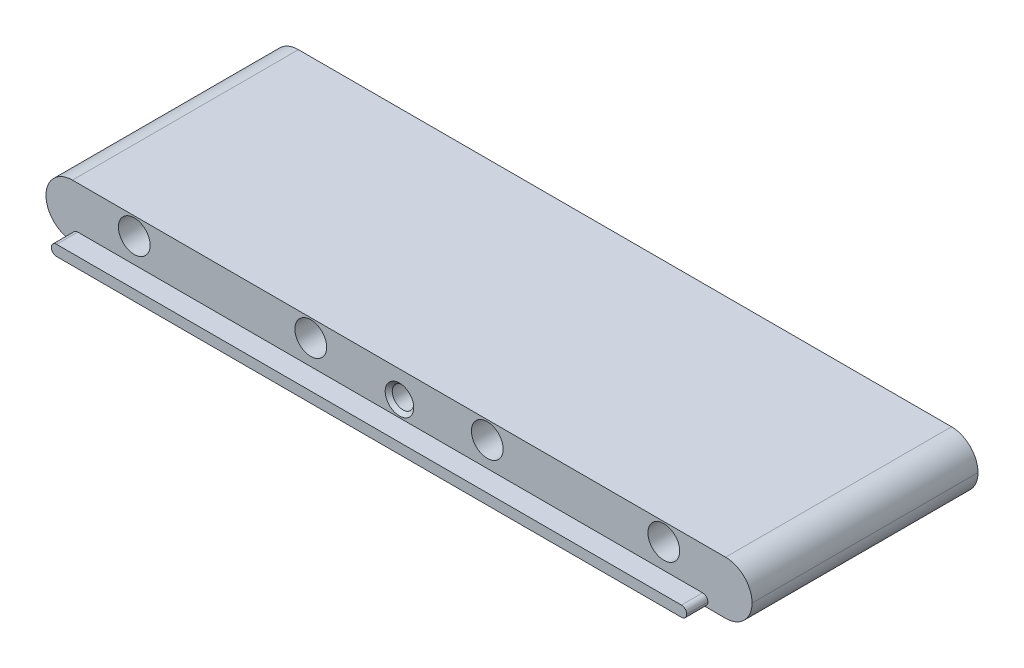
ISO-10303-21;
HEADER;
FILE_DESCRIPTION(('STEP AP214'),'2;1');
FILE_NAME('part.step','',(''),(''),'','','');
FILE_SCHEMA(('AUTOMOTIVE_DESIGN { 1 0 10303 214 1 1 1 1 }'));
ENDSEC;
DATA;
#1=APPLICATION_CONTEXT('core data for automotive mechanical design processes');
#2=APPLICATION_PROTOCOL_DEFINITION('international standard','automotive_design',2000,#1);
#3=PRODUCT_CONTEXT('',#1,'mechanical');
#4=PRODUCT('Part','Part','',(#3));
#5=PRODUCT_RELATED_PRODUCT_CATEGORY('part','',(#4));
#6=PRODUCT_DEFINITION_FORMATION('','',#4);
#7=PRODUCT_DEFINITION_CONTEXT('part definition',#1,'design');
#8=PRODUCT_DEFINITION('design','',#6,#7);
#9=PRODUCT_DEFINITION_SHAPE('','',#8);
#10=(LENGTH_UNIT() NAMED_UNIT(*) SI_UNIT(.MILLI.,.METRE.));
#11=(NAMED_UNIT(*) PLANE_ANGLE_UNIT() SI_UNIT($,.RADIAN.));
#12=(NAMED_UNIT(*) SI_UNIT($,.STERADIAN.) SOLID_ANGLE_UNIT());
#13=UNCERTAINTY_MEASURE_WITH_UNIT(LENGTH_MEASURE(1.E-05),#10,'distance_accuracy_value','');
#14=(GEOMETRIC_REPRESENTATION_CONTEXT(3) GLOBAL_UNCERTAINTY_ASSIGNED_CONTEXT((#13)) GLOBAL_UNIT_ASSIGNED_CONTEXT((#10,
#11,#12)) REPRESENTATION_CONTEXT('',''));
#15=CARTESIAN_POINT('',(0.,0.,0.));
#16=DIRECTION('',(0.,0.,1.));
#17=DIRECTION('',(1.,0.,0.));
#18=AXIS2_PLACEMENT_3D('',#15,#16,#17);
#19=CARTESIAN_POINT('',(0.,0.,64.));
#20=DIRECTION('',(0.,0.,-1.));
#21=DIRECTION('',(-1.,0.,0.));
#22=AXIS2_PLACEMENT_3D('',#19,#20,#21);
#23=PLANE('',#22);
#24=CARTESIAN_POINT('',(0.125314072334449,0.,64.));
#25=DIRECTION('',(0.,0.,-1.));
#26=DIRECTION('',(-1.,0.,0.));
#27=AXIS2_PLACEMENT_3D('',#24,#25,#26);
#28=CIRCLE('',#27,4.05);
#29=CARTESIAN_POINT('',(-3.92468592766555,0.,64.));
#30=VERTEX_POINT('',#29);
#31=EDGE_CURVE('E12',#30,#30,#28,.T.);
#32=ORIENTED_EDGE('',*,*,#31,.T.);
#33=EDGE_LOOP('',(#32));
#34=FACE_BOUND('',#33,.T.);
#35=CARTESIAN_POINT('',(75.,2.5,64.));
#36=DIRECTION('',(0.,0.,1.));
#37=DIRECTION('',(1.,0.,0.));
#38=AXIS2_PLACEMENT_3D('',#35,#36,#37);
#39=CIRCLE('',#38,4.5);
#40=CARTESIAN_POINT('',(79.5,2.5,64.));
#41=VERTEX_POINT('',#40);
#42=EDGE_CURVE('E397',#41,#41,#39,.T.);
#43=ORIENTED_EDGE('',*,*,#42,.F.);
#44=EDGE_LOOP('',(#43));
#45=FACE_BOUND('',#44,.T.);
#46=CARTESIAN_POINT('',(25.,2.49999999999948,64.));
#47=DIRECTION('',(0.,0.,1.));
#48=DIRECTION('',(1.,0.,0.));
#49=AXIS2_PLACEMENT_3D('',#46,#47,#48);
#50=CIRCLE('',#49,4.5);
#51=CARTESIAN_POINT('',(29.5,2.49999999999948,64.));
#52=VERTEX_POINT('',#51);
#53=EDGE_CURVE('E389',#52,#52,#50,.T.);
#54=ORIENTED_EDGE('',*,*,#53,.F.);
#55=EDGE_LOOP('',(#54));
#56=FACE_BOUND('',#55,.T.);
#57=CARTESIAN_POINT('',(-25.,2.4999999999993,64.));
#58=DIRECTION('',(0.,0.,1.));
#59=DIRECTION('',(1.,0.,0.));
#60=AXIS2_PLACEMENT_3D('',#57,#58,#59);
#61=CIRCLE('',#60,4.5);
#62=CARTESIAN_POINT('',(-20.5,2.4999999999993,64.));
#63=VERTEX_POINT('',#62);
#64=EDGE_CURVE('E381',#63,#63,#61,.T.);
#65=ORIENTED_EDGE('',*,*,#64,.F.);
#66=EDGE_LOOP('',(#65));
#67=FACE_BOUND('',#66,.T.);
#68=CARTESIAN_POINT('',(-75.,2.49999999999895,64.));
#69=DIRECTION('',(0.,0.,1.));
#70=DIRECTION('',(1.,0.,0.));
#71=AXIS2_PLACEMENT_3D('',#68,#69,#70);
#72=CIRCLE('',#71,4.5);
#73=CARTESIAN_POINT('',(-70.5,2.49999999999895,64.));
#74=VERTEX_POINT('',#73);
#75=EDGE_CURVE('E377',#74,#74,#72,.T.);
#76=ORIENTED_EDGE('',*,*,#75,.F.);
#77=EDGE_LOOP('',(#76));
#78=FACE_BOUND('',#77,.T.);
#79=CARTESIAN_POINT('',(-91.,-6.,64.));
#80=DIRECTION('',(0.,0.,-1.));
#81=DIRECTION('',(-1.,0.,0.));
#82=AXIS2_PLACEMENT_3D('',#79,#80,#81);
#83=CIRCLE('',#82,1.5);
#84=CARTESIAN_POINT('',(-91.,-7.5,64.));
#85=VERTEX_POINT('',#84);
#86=CARTESIAN_POINT('',(-92.5,-6.,64.));
#87=VERTEX_POINT('',#86);
#88=EDGE_CURVE('E66',#85,#87,#83,.T.);
#89=ORIENTED_EDGE('',*,*,#88,.T.);
#90=CARTESIAN_POINT('',(-91.,-6.,64.));
#91=DIRECTION('',(0.,0.,-1.));
#92=DIRECTION('',(-1.,0.,0.));
#93=AXIS2_PLACEMENT_3D('',#90,#91,#92);
#94=CIRCLE('',#93,1.5);
#95=CARTESIAN_POINT('',(-91.,-4.5,64.));
#96=VERTEX_POINT('',#95);
#97=EDGE_CURVE('E275',#87,#96,#94,.T.);
#98=ORIENTED_EDGE('',*,*,#97,.T.);
#99=DIRECTION('',(-1.,0.,0.));
#100=VECTOR('',#99,1.);
#101=CARTESIAN_POINT('',(-92.5,-4.5,64.));
#102=LINE('',#101,#100);
#103=CARTESIAN_POINT('',(85.9999999999999,-4.5,64.));
#104=VERTEX_POINT('',#103);
#105=EDGE_CURVE('E282',#104,#96,#102,.T.);
#106=ORIENTED_EDGE('',*,*,#105,.F.);
#107=CARTESIAN_POINT('',(86.,-6.,64.));
#108=DIRECTION('',(0.,0.,-1.));
#109=DIRECTION('',(-1.,0.,0.));
#110=AXIS2_PLACEMENT_3D('',#107,#108,#109);
#111=CIRCLE('',#110,1.5);
#112=CARTESIAN_POINT('',(87.5,-6.,64.));
#113=VERTEX_POINT('',#112);
#114=EDGE_CURVE('E73',#104,#113,#111,.T.);
#115=ORIENTED_EDGE('',*,*,#114,.T.);
#116=CARTESIAN_POINT('',(86.,-6.,64.));
#117=DIRECTION('',(0.,0.,-1.));
#118=DIRECTION('',(-1.,0.,0.));
#119=AXIS2_PLACEMENT_3D('',#116,#117,#118);
#120=CIRCLE('',#119,1.5);
#121=CARTESIAN_POINT('',(86.,-7.5,64.));
#122=VERTEX_POINT('',#121);
#123=EDGE_CURVE('E270',#113,#122,#120,.T.);
#124=ORIENTED_EDGE('',*,*,#123,.T.);
#125=DIRECTION('',(1.,0.,0.));
#126=VECTOR('',#125,1.);
#127=CARTESIAN_POINT('',(-100.,-7.5,64.));
#128=LINE('',#127,#126);
#129=CARTESIAN_POINT('',(92.5,-7.5,64.));
#130=VERTEX_POINT('',#129);
#131=EDGE_CURVE('E183',#122,#130,#128,.T.);
#132=ORIENTED_EDGE('',*,*,#131,.T.);
#133=CARTESIAN_POINT('',(92.5,0.,64.));
#134=DIRECTION('',(0.,0.,-1.));
#135=DIRECTION('',(-1.,0.,0.));
#136=AXIS2_PLACEMENT_3D('',#133,#134,#135);
#137=CIRCLE('',#136,7.5);
#138=CARTESIAN_POINT('',(100.,0.,64.));
#139=VERTEX_POINT('',#138);
#140=EDGE_CURVE('E218',#130,#139,#137,.F.);
#141=ORIENTED_EDGE('',*,*,#140,.T.);
#142=CARTESIAN_POINT('',(92.5,0.,64.));
#143=DIRECTION('',(0.,0.,-1.));
#144=DIRECTION('',(-1.,0.,0.));
#145=AXIS2_PLACEMENT_3D('',#142,#143,#144);
#146=CIRCLE('',#145,7.5);
#147=CARTESIAN_POINT('',(92.5,7.5,64.));
#148=VERTEX_POINT('',#147);
#149=EDGE_CURVE('E221',#139,#148,#146,.F.);
#150=ORIENTED_EDGE('',*,*,#149,.T.);
#151=DIRECTION('',(-1.,0.,0.));
#152=VECTOR('',#151,1.);
#153=CARTESIAN_POINT('',(-100.,7.5,64.));
#154=LINE('',#153,#152);
#155=CARTESIAN_POINT('',(-92.5,7.5,64.));
#156=VERTEX_POINT('',#155);
#157=EDGE_CURVE('E162',#148,#156,#154,.T.);
#158=ORIENTED_EDGE('',*,*,#157,.T.);
#159=CARTESIAN_POINT('',(-92.5,0.,64.));
#160=DIRECTION('',(0.,0.,-1.));
#161=DIRECTION('',(-1.,0.,0.));
#162=AXIS2_PLACEMENT_3D('',#159,#160,#161);
#163=CIRCLE('',#162,7.5);
#164=CARTESIAN_POINT('',(-100.,0.,64.));
#165=VERTEX_POINT('',#164);
#166=EDGE_CURVE('E215',#156,#165,#163,.F.);
#167=ORIENTED_EDGE('',*,*,#166,.T.);
#168=CARTESIAN_POINT('',(-92.5,0.,64.));
#169=DIRECTION('',(0.,0.,-1.));
#170=DIRECTION('',(-1.,0.,0.));
#171=AXIS2_PLACEMENT_3D('',#168,#169,#170);
#172=CIRCLE('',#171,7.5);
#173=CARTESIAN_POINT('',(-92.5,-7.5,64.));
#174=VERTEX_POINT('',#173);
#175=EDGE_CURVE('E151',#165,#174,#172,.F.);
#176=ORIENTED_EDGE('',*,*,#175,.T.);
#177=DIRECTION('',(-1.,0.,0.));
#178=VECTOR('',#177,1.);
#179=CARTESIAN_POINT('',(-100.,-7.5,64.));
#180=LINE('',#179,#178);
#181=EDGE_CURVE('E258',#85,#174,#180,.T.);
#182=ORIENTED_EDGE('',*,*,#181,.F.);
#183=EDGE_LOOP('',(#89,#98,#106,#115,#124,#132,#141,#150,#158,#167,#176,#182));
#184=FACE_BOUND('',#183,.T.);
#185=ADVANCED_FACE('F49',(#34,#45,#56,#67,#78,#184),#23,.F.);
#186=CARTESIAN_POINT('',(0.,0.,0.));
#187=DIRECTION('',(0.,0.,-1.));
#188=DIRECTION('',(-1.,0.,0.));
#189=AXIS2_PLACEMENT_3D('',#186,#187,#188);
#190=PLANE('',#189);
#191=CARTESIAN_POINT('',(-25.,2.4999999999993,0.));
#192=DIRECTION('',(0.,0.,1.));
#193=DIRECTION('',(1.,0.,0.));
#194=AXIS2_PLACEMENT_3D('',#191,#192,#193);
#195=CIRCLE('',#194,2.6);
#196=CARTESIAN_POINT('',(-22.4,2.4999999999993,0.));
#197=VERTEX_POINT('',#196);
#198=EDGE_CURVE('E410',#197,#197,#195,.T.);
#199=ORIENTED_EDGE('',*,*,#198,.T.);
#200=EDGE_LOOP('',(#199));
#201=FACE_BOUND('',#200,.T.);
#202=CARTESIAN_POINT('',(75.,2.5,0.));
#203=DIRECTION('',(0.,0.,1.));
#204=DIRECTION('',(1.,0.,0.));
#205=AXIS2_PLACEMENT_3D('',#202,#203,#204);
#206=CIRCLE('',#205,2.6);
#207=CARTESIAN_POINT('',(77.6,2.5,0.));
#208=VERTEX_POINT('',#207);
#209=EDGE_CURVE('E173',#208,#208,#206,.T.);
#210=ORIENTED_EDGE('',*,*,#209,.T.);
#211=EDGE_LOOP('',(#210));
#212=FACE_BOUND('',#211,.T.);
#213=DIRECTION('',(-1.,0.,0.));
#214=VECTOR('',#213,1.);
#215=CARTESIAN_POINT('',(-100.,7.5,0.));
#216=LINE('',#215,#214);
#217=CARTESIAN_POINT('',(92.5,7.5,0.));
#218=VERTEX_POINT('',#217);
#219=CARTESIAN_POINT('',(-92.5,7.5,0.));
#220=VERTEX_POINT('',#219);
#221=EDGE_CURVE('E159',#218,#220,#216,.T.);
#222=ORIENTED_EDGE('',*,*,#221,.F.);
#223=CARTESIAN_POINT('',(92.5,0.,0.));
#224=DIRECTION('',(0.,0.,-1.));
#225=DIRECTION('',(-1.,0.,0.));
#226=AXIS2_PLACEMENT_3D('',#223,#224,#225);
#227=CIRCLE('',#226,7.5);
#228=CARTESIAN_POINT('',(100.,0.,0.));
#229=VERTEX_POINT('',#228);
#230=EDGE_CURVE('E140',#218,#229,#227,.T.);
#231=ORIENTED_EDGE('',*,*,#230,.T.);
#232=CARTESIAN_POINT('',(92.5,0.,0.));
#233=DIRECTION('',(0.,0.,-1.));
#234=DIRECTION('',(-1.,0.,0.));
#235=AXIS2_PLACEMENT_3D('',#232,#233,#234);
#236=CIRCLE('',#235,7.5);
#237=CARTESIAN_POINT('',(92.5,-7.5,0.));
#238=VERTEX_POINT('',#237);
#239=EDGE_CURVE('E152',#229,#238,#236,.T.);
#240=ORIENTED_EDGE('',*,*,#239,.T.);
#241=DIRECTION('',(1.,0.,0.));
#242=VECTOR('',#241,1.);
#243=CARTESIAN_POINT('',(-100.,-7.5,0.));
#244=LINE('',#243,#242);
#245=CARTESIAN_POINT('',(-92.5,-7.5,0.));
#246=VERTEX_POINT('',#245);
#247=EDGE_CURVE('E172',#246,#238,#244,.T.);
#248=ORIENTED_EDGE('',*,*,#247,.F.);
#249=CARTESIAN_POINT('',(-92.5,0.,0.));
#250=DIRECTION('',(0.,0.,-1.));
#251=DIRECTION('',(-1.,0.,0.));
#252=AXIS2_PLACEMENT_3D('',#249,#250,#251);
#253=CIRCLE('',#252,7.5);
#254=CARTESIAN_POINT('',(-100.,0.,0.));
#255=VERTEX_POINT('',#254);
#256=EDGE_CURVE('E164',#246,#255,#253,.T.);
#257=ORIENTED_EDGE('',*,*,#256,.T.);
#258=CARTESIAN_POINT('',(-92.5,0.,0.));
#259=DIRECTION('',(0.,0.,-1.));
#260=DIRECTION('',(-1.,0.,0.));
#261=AXIS2_PLACEMENT_3D('',#258,#259,#260);
#262=CIRCLE('',#261,7.5);
#263=EDGE_CURVE('E170',#255,#220,#262,.T.);
#264=ORIENTED_EDGE('',*,*,#263,.T.);
#265=EDGE_LOOP('',(#222,#231,#240,#248,#257,#264));
#266=FACE_BOUND('',#265,.T.);
#267=CARTESIAN_POINT('',(25.,2.49999999999948,0.));
#268=DIRECTION('',(0.,0.,1.));
#269=DIRECTION('',(1.,0.,0.));
#270=AXIS2_PLACEMENT_3D('',#267,#268,#269);
#271=CIRCLE('',#270,2.6);
#272=CARTESIAN_POINT('',(27.6,2.49999999999948,0.));
#273=VERTEX_POINT('',#272);
#274=EDGE_CURVE('E180',#273,#273,#271,.T.);
#275=ORIENTED_EDGE('',*,*,#274,.T.);
#276=EDGE_LOOP('',(#275));
#277=FACE_BOUND('',#276,.T.);
#278=CARTESIAN_POINT('',(-75.,2.49999999999895,0.));
#279=DIRECTION('',(0.,0.,1.));
#280=DIRECTION('',(1.,0.,0.));
#281=AXIS2_PLACEMENT_3D('',#278,#279,#280);
#282=CIRCLE('',#281,2.6);
#283=CARTESIAN_POINT('',(-72.4,2.49999999999895,0.));
#284=VERTEX_POINT('',#283);
#285=EDGE_CURVE('E203',#284,#284,#282,.T.);
#286=ORIENTED_EDGE('',*,*,#285,.T.);
#287=EDGE_LOOP('',(#286));
#288=FACE_BOUND('',#287,.T.);
#289=ADVANCED_FACE('F167',(#201,#212,#266,#277,#288),#190,.T.);
#290=CARTESIAN_POINT('',(-100.,7.5,64.));
#291=DIRECTION('',(0.,-1.,0.));
#292=DIRECTION('',(1.,0.,0.));
#293=AXIS2_PLACEMENT_3D('',#290,#291,#292);
#294=PLANE('',#293);
#295=ORIENTED_EDGE('',*,*,#157,.F.);
#296=DIRECTION('',(0.,0.,-1.));
#297=VECTOR('',#296,1.);
#298=CARTESIAN_POINT('',(92.5,7.5,64.));
#299=LINE('',#298,#297);
#300=EDGE_CURVE('E144',#148,#218,#299,.T.);
#301=ORIENTED_EDGE('',*,*,#300,.T.);
#302=ORIENTED_EDGE('',*,*,#221,.T.);
#303=DIRECTION('',(0.,0.,-1.));
#304=VECTOR('',#303,1.);
#305=CARTESIAN_POINT('',(-92.5,7.5,64.));
#306=LINE('',#305,#304);
#307=EDGE_CURVE('E165',#220,#156,#306,.F.);
#308=ORIENTED_EDGE('',*,*,#307,.T.);
#309=EDGE_LOOP('',(#295,#301,#302,#308));
#310=FACE_BOUND('',#309,.T.);
#311=ADVANCED_FACE('F157',(#310),#294,.F.);
#312=CARTESIAN_POINT('',(-100.,-7.5,64.));
#313=DIRECTION('',(0.,1.,0.));
#314=DIRECTION('',(-1.,0.,0.));
#315=AXIS2_PLACEMENT_3D('',#312,#313,#314);
#316=PLANE('',#315);
#317=ORIENTED_EDGE('',*,*,#131,.F.);
#318=DIRECTION('',(0.,0.,-1.));
#319=VECTOR('',#318,1.);
#320=CARTESIAN_POINT('',(86.,-7.5,64.));
#321=LINE('',#320,#319);
#322=CARTESIAN_POINT('',(85.9999999999999,-7.5,70.));
#323=VERTEX_POINT('',#322);
#324=EDGE_CURVE('E265',#122,#323,#321,.F.);
#325=ORIENTED_EDGE('',*,*,#324,.T.);
#326=DIRECTION('',(1.,0.,0.));
#327=VECTOR('',#326,1.);
#328=CARTESIAN_POINT('',(-92.5,-7.5,70.));
#329=LINE('',#328,#327);
#330=CARTESIAN_POINT('',(-91.,-7.5,70.));
#331=VERTEX_POINT('',#330);
#332=EDGE_CURVE('E364',#331,#323,#329,.T.);
#333=ORIENTED_EDGE('',*,*,#332,.F.);
#334=DIRECTION('',(0.,0.,-1.));
#335=VECTOR('',#334,1.);
#336=CARTESIAN_POINT('',(-91.,-7.5,64.));
#337=LINE('',#336,#335);
#338=EDGE_CURVE('E261',#331,#85,#337,.T.);
#339=ORIENTED_EDGE('',*,*,#338,.T.);
#340=ORIENTED_EDGE('',*,*,#181,.T.);
#341=DIRECTION('',(0.,0.,-1.));
#342=VECTOR('',#341,1.);
#343=CARTESIAN_POINT('',(-92.5,-7.5,64.));
#344=LINE('',#343,#342);
#345=EDGE_CURVE('E224',#174,#246,#344,.T.);
#346=ORIENTED_EDGE('',*,*,#345,.T.);
#347=ORIENTED_EDGE('',*,*,#247,.T.);
#348=DIRECTION('',(0.,0.,-1.));
#349=VECTOR('',#348,1.);
#350=CARTESIAN_POINT('',(92.5,-7.5,64.));
#351=LINE('',#350,#349);
#352=EDGE_CURVE('E227',#238,#130,#351,.F.);
#353=ORIENTED_EDGE('',*,*,#352,.T.);
#354=EDGE_LOOP('',(#317,#325,#333,#339,#340,#346,#347,#353));
#355=FACE_BOUND('',#354,.T.);
#356=ADVANCED_FACE('F317',(#355),#316,.F.);
#357=CARTESIAN_POINT('',(75.,2.5,64.));
#358=DIRECTION('',(0.,0.,-1.));
#359=DIRECTION('',(-1.,0.,0.));
#360=AXIS2_PLACEMENT_3D('',#357,#358,#359);
#361=CYLINDRICAL_SURFACE('',#360,2.6);
#362=CARTESIAN_POINT('',(75.,2.5,7.));
#363=DIRECTION('',(0.,0.,-1.));
#364=DIRECTION('',(-1.,0.,0.));
#365=AXIS2_PLACEMENT_3D('',#362,#363,#364);
#366=CIRCLE('',#365,2.6);
#367=CARTESIAN_POINT('',(72.4,2.5,7.));
#368=VERTEX_POINT('',#367);
#369=EDGE_CURVE('E199',#368,#368,#366,.T.);
#370=ORIENTED_EDGE('',*,*,#369,.F.);
#371=EDGE_LOOP('',(#370));
#372=FACE_BOUND('',#371,.T.);
#373=ORIENTED_EDGE('',*,*,#209,.F.);
#374=EDGE_LOOP('',(#373));
#375=FACE_BOUND('',#374,.T.);
#376=ADVANCED_FACE('F314',(#372,#375),#361,.F.);
#377=CARTESIAN_POINT('',(25.,2.49999999999948,64.));
#378=DIRECTION('',(0.,0.,-1.));
#379=DIRECTION('',(-1.,0.,0.));
#380=AXIS2_PLACEMENT_3D('',#377,#378,#379);
#381=CYLINDRICAL_SURFACE('',#380,2.6);
#382=CARTESIAN_POINT('',(25.,2.49999999999948,7.));
#383=DIRECTION('',(0.,0.,-1.));
#384=DIRECTION('',(-1.,0.,0.));
#385=AXIS2_PLACEMENT_3D('',#382,#383,#384);
#386=CIRCLE('',#385,2.6);
#387=CARTESIAN_POINT('',(22.4,2.49999999999948,7.));
#388=VERTEX_POINT('',#387);
#389=EDGE_CURVE('E195',#388,#388,#386,.T.);
#390=ORIENTED_EDGE('',*,*,#389,.F.);
#391=EDGE_LOOP('',(#390));
#392=FACE_BOUND('',#391,.T.);
#393=ORIENTED_EDGE('',*,*,#274,.F.);
#394=EDGE_LOOP('',(#393));
#395=FACE_BOUND('',#394,.T.);
#396=ADVANCED_FACE('F475',(#392,#395),#381,.F.);
#397=CARTESIAN_POINT('',(-25.,2.4999999999993,64.));
#398=DIRECTION('',(0.,0.,-1.));
#399=DIRECTION('',(-1.,0.,0.));
#400=AXIS2_PLACEMENT_3D('',#397,#398,#399);
#401=CYLINDRICAL_SURFACE('',#400,2.6);
#402=CARTESIAN_POINT('',(-25.,2.4999999999993,7.));
#403=DIRECTION('',(0.,0.,-1.));
#404=DIRECTION('',(-1.,0.,0.));
#405=AXIS2_PLACEMENT_3D('',#402,#403,#404);
#406=CIRCLE('',#405,2.6);
#407=CARTESIAN_POINT('',(-27.6,2.4999999999993,7.));
#408=VERTEX_POINT('',#407);
#409=EDGE_CURVE('E190',#408,#408,#406,.T.);
#410=ORIENTED_EDGE('',*,*,#409,.F.);
#411=EDGE_LOOP('',(#410));
#412=FACE_BOUND('',#411,.T.);
#413=ORIENTED_EDGE('',*,*,#198,.F.);
#414=EDGE_LOOP('',(#413));
#415=FACE_BOUND('',#414,.T.);
#416=ADVANCED_FACE('F472',(#412,#415),#401,.F.);
#417=CARTESIAN_POINT('',(-75.,2.49999999999895,64.));
#418=DIRECTION('',(0.,0.,-1.));
#419=DIRECTION('',(-1.,0.,0.));
#420=AXIS2_PLACEMENT_3D('',#417,#418,#419);
#421=CYLINDRICAL_SURFACE('',#420,2.6);
#422=CARTESIAN_POINT('',(-75.,2.49999999999895,7.));
#423=DIRECTION('',(0.,0.,-1.));
#424=DIRECTION('',(-1.,0.,0.));
#425=AXIS2_PLACEMENT_3D('',#422,#423,#424);
#426=CIRCLE('',#425,2.6);
#427=CARTESIAN_POINT('',(-77.6,2.49999999999895,7.));
#428=VERTEX_POINT('',#427);
#429=EDGE_CURVE('E186',#428,#428,#426,.T.);
#430=ORIENTED_EDGE('',*,*,#429,.F.);
#431=EDGE_LOOP('',(#430));
#432=FACE_BOUND('',#431,.T.);
#433=ORIENTED_EDGE('',*,*,#285,.F.);
#434=EDGE_LOOP('',(#433));
#435=FACE_BOUND('',#434,.T.);
#436=ADVANCED_FACE('F446',(#432,#435),#421,.F.);
#437=CARTESIAN_POINT('',(0.,0.,7.));
#438=DIRECTION('',(0.,0.,-1.));
#439=DIRECTION('',(-1.,0.,0.));
#440=AXIS2_PLACEMENT_3D('',#437,#438,#439);
#441=PLANE('',#440);
#442=ORIENTED_EDGE('',*,*,#429,.T.);
#443=EDGE_LOOP('',(#442));
#444=FACE_BOUND('',#443,.T.);
#445=CARTESIAN_POINT('',(-75.,2.49999999999895,7.));
#446=DIRECTION('',(0.,0.,-1.));
#447=DIRECTION('',(-1.,0.,0.));
#448=AXIS2_PLACEMENT_3D('',#445,#446,#447);
#449=CIRCLE('',#448,4.5);
#450=CARTESIAN_POINT('',(-79.5,2.49999999999895,7.));
#451=VERTEX_POINT('',#450);
#452=EDGE_CURVE('E191',#451,#451,#449,.F.);
#453=ORIENTED_EDGE('',*,*,#452,.T.);
#454=EDGE_LOOP('',(#453));
#455=FACE_BOUND('',#454,.T.);
#456=ADVANCED_FACE('F442',(#444,#455),#441,.F.);
#457=CARTESIAN_POINT('',(-75.,2.49999999999895,-12.7279220613579));
#458=DIRECTION('',(0.,0.,1.));
#459=DIRECTION('',(1.,0.,0.));
#460=AXIS2_PLACEMENT_3D('',#457,#458,#459);
#461=CYLINDRICAL_SURFACE('',#460,4.5);
#462=ORIENTED_EDGE('',*,*,#75,.T.);
#463=EDGE_LOOP('',(#462));
#464=FACE_BOUND('',#463,.T.);
#465=ORIENTED_EDGE('',*,*,#452,.F.);
#466=EDGE_LOOP('',(#465));
#467=FACE_BOUND('',#466,.T.);
#468=ADVANCED_FACE('F438',(#464,#467),#461,.F.);
#469=CARTESIAN_POINT('',(0.,0.,7.));
#470=DIRECTION('',(0.,0.,-1.));
#471=DIRECTION('',(-1.,0.,0.));
#472=AXIS2_PLACEMENT_3D('',#469,#470,#471);
#473=PLANE('',#472);
#474=ORIENTED_EDGE('',*,*,#409,.T.);
#475=EDGE_LOOP('',(#474));
#476=FACE_BOUND('',#475,.T.);
#477=CARTESIAN_POINT('',(-25.,2.4999999999993,7.));
#478=DIRECTION('',(0.,0.,-1.));
#479=DIRECTION('',(-1.,0.,0.));
#480=AXIS2_PLACEMENT_3D('',#477,#478,#479);
#481=CIRCLE('',#480,4.5);
#482=CARTESIAN_POINT('',(-29.5,2.4999999999993,7.));
#483=VERTEX_POINT('',#482);
#484=EDGE_CURVE('E385',#483,#483,#481,.F.);
#485=ORIENTED_EDGE('',*,*,#484,.T.);
#486=EDGE_LOOP('',(#485));
#487=FACE_BOUND('',#486,.T.);
#488=ADVANCED_FACE('F441',(#476,#487),#473,.F.);
#489=CARTESIAN_POINT('',(-25.,2.4999999999993,-12.7279220613579));
#490=DIRECTION('',(0.,0.,1.));
#491=DIRECTION('',(1.,0.,0.));
#492=AXIS2_PLACEMENT_3D('',#489,#490,#491);
#493=CYLINDRICAL_SURFACE('',#492,4.5);
#494=ORIENTED_EDGE('',*,*,#64,.T.);
#495=EDGE_LOOP('',(#494));
#496=FACE_BOUND('',#495,.T.);
#497=ORIENTED_EDGE('',*,*,#484,.F.);
#498=EDGE_LOOP('',(#497));
#499=FACE_BOUND('',#498,.T.);
#500=ADVANCED_FACE('F450',(#496,#499),#493,.F.);
#501=CARTESIAN_POINT('',(0.,0.,7.));
#502=DIRECTION('',(0.,0.,-1.));
#503=DIRECTION('',(-1.,0.,0.));
#504=AXIS2_PLACEMENT_3D('',#501,#502,#503);
#505=PLANE('',#504);
#506=ORIENTED_EDGE('',*,*,#389,.T.);
#507=EDGE_LOOP('',(#506));
#508=FACE_BOUND('',#507,.T.);
#509=CARTESIAN_POINT('',(25.,2.49999999999948,7.));
#510=DIRECTION('',(0.,0.,-1.));
#511=DIRECTION('',(-1.,0.,0.));
#512=AXIS2_PLACEMENT_3D('',#509,#510,#511);
#513=CIRCLE('',#512,4.5);
#514=CARTESIAN_POINT('',(20.5,2.49999999999948,7.));
#515=VERTEX_POINT('',#514);
#516=EDGE_CURVE('E393',#515,#515,#513,.F.);
#517=ORIENTED_EDGE('',*,*,#516,.T.);
#518=EDGE_LOOP('',(#517));
#519=FACE_BOUND('',#518,.T.);
#520=ADVANCED_FACE('F454',(#508,#519),#505,.F.);
#521=CARTESIAN_POINT('',(25.,2.49999999999948,-12.7279220613579));
#522=DIRECTION('',(0.,0.,1.));
#523=DIRECTION('',(1.,0.,0.));
#524=AXIS2_PLACEMENT_3D('',#521,#522,#523);
#525=CYLINDRICAL_SURFACE('',#524,4.5);
#526=ORIENTED_EDGE('',*,*,#53,.T.);
#527=EDGE_LOOP('',(#526));
#528=FACE_BOUND('',#527,.T.);
#529=ORIENTED_EDGE('',*,*,#516,.F.);
#530=EDGE_LOOP('',(#529));
#531=FACE_BOUND('',#530,.T.);
#532=ADVANCED_FACE('F458',(#528,#531),#525,.F.);
#533=CARTESIAN_POINT('',(0.,0.,7.));
#534=DIRECTION('',(0.,0.,-1.));
#535=DIRECTION('',(-1.,0.,0.));
#536=AXIS2_PLACEMENT_3D('',#533,#534,#535);
#537=PLANE('',#536);
#538=ORIENTED_EDGE('',*,*,#369,.T.);
#539=EDGE_LOOP('',(#538));
#540=FACE_BOUND('',#539,.T.);
#541=CARTESIAN_POINT('',(75.,2.5,7.));
#542=DIRECTION('',(0.,0.,-1.));
#543=DIRECTION('',(-1.,0.,0.));
#544=AXIS2_PLACEMENT_3D('',#541,#542,#543);
#545=CIRCLE('',#544,4.5);
#546=CARTESIAN_POINT('',(70.5,2.5,7.));
#547=VERTEX_POINT('',#546);
#548=EDGE_CURVE('E234',#547,#547,#545,.F.);
#549=ORIENTED_EDGE('',*,*,#548,.T.);
#550=EDGE_LOOP('',(#549));
#551=FACE_BOUND('',#550,.T.);
#552=ADVANCED_FACE('F462',(#540,#551),#537,.F.);
#553=CARTESIAN_POINT('',(75.,2.5,-12.7279220613579));
#554=DIRECTION('',(0.,0.,1.));
#555=DIRECTION('',(1.,0.,0.));
#556=AXIS2_PLACEMENT_3D('',#553,#554,#555);
#557=CYLINDRICAL_SURFACE('',#556,4.5);
#558=ORIENTED_EDGE('',*,*,#42,.T.);
#559=EDGE_LOOP('',(#558));
#560=FACE_BOUND('',#559,.T.);
#561=ORIENTED_EDGE('',*,*,#548,.F.);
#562=EDGE_LOOP('',(#561));
#563=FACE_BOUND('',#562,.T.);
#564=ADVANCED_FACE('F329',(#560,#563),#557,.F.);
#565=CARTESIAN_POINT('',(92.5,0.,64.));
#566=DIRECTION('',(0.,0.,-1.));
#567=DIRECTION('',(-1.,0.,0.));
#568=AXIS2_PLACEMENT_3D('',#565,#566,#567);
#569=CYLINDRICAL_SURFACE('',#568,7.5);
#570=DIRECTION('',(0.,0.,-1.));
#571=VECTOR('',#570,1.);
#572=CARTESIAN_POINT('',(100.,0.,64.));
#573=LINE('',#572,#571);
#574=EDGE_CURVE('E146',#139,#229,#573,.T.);
#575=ORIENTED_EDGE('',*,*,#574,.F.);
#576=ORIENTED_EDGE('',*,*,#140,.F.);
#577=ORIENTED_EDGE('',*,*,#352,.F.);
#578=ORIENTED_EDGE('',*,*,#239,.F.);
#579=EDGE_LOOP('',(#575,#576,#577,#578));
#580=FACE_BOUND('',#579,.T.);
#581=ADVANCED_FACE('F326',(#580),#569,.T.);
#582=CARTESIAN_POINT('',(92.5,0.,64.));
#583=DIRECTION('',(0.,0.,-1.));
#584=DIRECTION('',(-1.,0.,0.));
#585=AXIS2_PLACEMENT_3D('',#582,#583,#584);
#586=CYLINDRICAL_SURFACE('',#585,7.5);
#587=ORIENTED_EDGE('',*,*,#149,.F.);
#588=ORIENTED_EDGE('',*,*,#574,.T.);
#589=ORIENTED_EDGE('',*,*,#230,.F.);
#590=ORIENTED_EDGE('',*,*,#300,.F.);
#591=EDGE_LOOP('',(#587,#588,#589,#590));
#592=FACE_BOUND('',#591,.T.);
#593=ADVANCED_FACE('F143',(#592),#586,.T.);
#594=CARTESIAN_POINT('',(-92.5,0.,64.));
#595=DIRECTION('',(0.,0.,-1.));
#596=DIRECTION('',(-1.,0.,0.));
#597=AXIS2_PLACEMENT_3D('',#594,#595,#596);
#598=CYLINDRICAL_SURFACE('',#597,7.5);
#599=ORIENTED_EDGE('',*,*,#345,.F.);
#600=ORIENTED_EDGE('',*,*,#175,.F.);
#601=DIRECTION('',(0.,0.,-1.));
#602=VECTOR('',#601,1.);
#603=CARTESIAN_POINT('',(-100.,0.,64.));
#604=LINE('',#603,#602);
#605=EDGE_CURVE('E235',#255,#165,#604,.F.);
#606=ORIENTED_EDGE('',*,*,#605,.F.);
#607=ORIENTED_EDGE('',*,*,#256,.F.);
#608=EDGE_LOOP('',(#599,#600,#606,#607));
#609=FACE_BOUND('',#608,.T.);
#610=ADVANCED_FACE('F325',(#609),#598,.T.);
#611=CARTESIAN_POINT('',(-92.5,0.,64.));
#612=DIRECTION('',(0.,0.,-1.));
#613=DIRECTION('',(-1.,0.,0.));
#614=AXIS2_PLACEMENT_3D('',#611,#612,#613);
#615=CYLINDRICAL_SURFACE('',#614,7.5);
#616=ORIENTED_EDGE('',*,*,#166,.F.);
#617=ORIENTED_EDGE('',*,*,#307,.F.);
#618=ORIENTED_EDGE('',*,*,#263,.F.);
#619=ORIENTED_EDGE('',*,*,#605,.T.);
#620=EDGE_LOOP('',(#616,#617,#618,#619));
#621=FACE_BOUND('',#620,.T.);
#622=ADVANCED_FACE('F331',(#621),#615,.T.);
#623=CARTESIAN_POINT('',(-92.5,-4.5,70.));
#624=DIRECTION('',(0.,-1.,0.));
#625=DIRECTION('',(0.,0.,-1.));
#626=AXIS2_PLACEMENT_3D('',#623,#624,#625);
#627=PLANE('',#626);
#628=DIRECTION('',(-1.,0.,0.));
#629=VECTOR('',#628,1.);
#630=CARTESIAN_POINT('',(-92.5,-4.5,70.));
#631=LINE('',#630,#629);
#632=CARTESIAN_POINT('',(85.9999999999999,-4.5,70.));
#633=VERTEX_POINT('',#632);
#634=CARTESIAN_POINT('',(-91.,-4.5,70.));
#635=VERTEX_POINT('',#634);
#636=EDGE_CURVE('E239',#633,#635,#631,.T.);
#637=ORIENTED_EDGE('',*,*,#636,.F.);
#638=DIRECTION('',(0.,0.,-1.));
#639=VECTOR('',#638,1.);
#640=CARTESIAN_POINT('',(86.,-4.5,70.));
#641=LINE('',#640,#639);
#642=EDGE_CURVE('E242',#633,#104,#641,.T.);
#643=ORIENTED_EDGE('',*,*,#642,.T.);
#644=ORIENTED_EDGE('',*,*,#105,.T.);
#645=DIRECTION('',(0.,0.,-1.));
#646=VECTOR('',#645,1.);
#647=CARTESIAN_POINT('',(-91.,-4.5,70.));
#648=LINE('',#647,#646);
#649=EDGE_CURVE('E231',#96,#635,#648,.F.);
#650=ORIENTED_EDGE('',*,*,#649,.T.);
#651=EDGE_LOOP('',(#637,#643,#644,#650));
#652=FACE_BOUND('',#651,.T.);
#653=ADVANCED_FACE('F334',(#652),#627,.F.);
#654=CARTESIAN_POINT('',(0.,0.,70.));
#655=DIRECTION('',(0.,0.,-1.));
#656=DIRECTION('',(-1.,0.,0.));
#657=AXIS2_PLACEMENT_3D('',#654,#655,#656);
#658=PLANE('',#657);
#659=CARTESIAN_POINT('',(86.,-6.,70.));
#660=DIRECTION('',(0.,0.,-1.));
#661=DIRECTION('',(-1.,0.,0.));
#662=AXIS2_PLACEMENT_3D('',#659,#660,#661);
#663=CIRCLE('',#662,1.5);
#664=CARTESIAN_POINT('',(87.5,-6.,70.));
#665=VERTEX_POINT('',#664);
#666=EDGE_CURVE('E252',#323,#665,#663,.F.);
#667=ORIENTED_EDGE('',*,*,#666,.T.);
#668=CARTESIAN_POINT('',(86.,-6.,70.));
#669=DIRECTION('',(0.,0.,-1.));
#670=DIRECTION('',(-1.,0.,0.));
#671=AXIS2_PLACEMENT_3D('',#668,#669,#670);
#672=CIRCLE('',#671,1.5);
#673=EDGE_CURVE('E255',#665,#633,#672,.F.);
#674=ORIENTED_EDGE('',*,*,#673,.T.);
#675=ORIENTED_EDGE('',*,*,#636,.T.);
#676=CARTESIAN_POINT('',(-91.,-6.,70.));
#677=DIRECTION('',(0.,0.,-1.));
#678=DIRECTION('',(-1.,0.,0.));
#679=AXIS2_PLACEMENT_3D('',#676,#677,#678);
#680=CIRCLE('',#679,1.5);
#681=CARTESIAN_POINT('',(-92.5,-6.,70.));
#682=VERTEX_POINT('',#681);
#683=EDGE_CURVE('E246',#635,#682,#680,.F.);
#684=ORIENTED_EDGE('',*,*,#683,.T.);
#685=CARTESIAN_POINT('',(-91.,-6.,70.));
#686=DIRECTION('',(0.,0.,-1.));
#687=DIRECTION('',(-1.,0.,0.));
#688=AXIS2_PLACEMENT_3D('',#685,#686,#687);
#689=CIRCLE('',#688,1.5);
#690=EDGE_CURVE('E249',#682,#331,#689,.F.);
#691=ORIENTED_EDGE('',*,*,#690,.T.);
#692=ORIENTED_EDGE('',*,*,#332,.T.);
#693=EDGE_LOOP('',(#667,#674,#675,#684,#691,#692));
#694=FACE_BOUND('',#693,.T.);
#695=ADVANCED_FACE('F347',(#694),#658,.F.);
#696=CARTESIAN_POINT('',(86.,-6.,70.));
#697=DIRECTION('',(0.,0.,-1.));
#698=DIRECTION('',(-1.,0.,0.));
#699=AXIS2_PLACEMENT_3D('',#696,#697,#698);
#700=CYLINDRICAL_SURFACE('',#699,1.5);
#701=DIRECTION('',(0.,0.,-1.));
#702=VECTOR('',#701,1.);
#703=CARTESIAN_POINT('',(87.5,-6.,70.));
#704=LINE('',#703,#702);
#705=EDGE_CURVE('E278',#665,#113,#704,.T.);
#706=ORIENTED_EDGE('',*,*,#705,.F.);
#707=ORIENTED_EDGE('',*,*,#666,.F.);
#708=ORIENTED_EDGE('',*,*,#324,.F.);
#709=ORIENTED_EDGE('',*,*,#123,.F.);
#710=EDGE_LOOP('',(#706,#707,#708,#709));
#711=FACE_BOUND('',#710,.T.);
#712=ADVANCED_FACE('F343',(#711),#700,.T.);
#713=CARTESIAN_POINT('',(86.,-6.,70.));
#714=DIRECTION('',(0.,0.,-1.));
#715=DIRECTION('',(-1.,0.,0.));
#716=AXIS2_PLACEMENT_3D('',#713,#714,#715);
#717=CYLINDRICAL_SURFACE('',#716,1.5);
#718=ORIENTED_EDGE('',*,*,#673,.F.);
#719=ORIENTED_EDGE('',*,*,#705,.T.);
#720=ORIENTED_EDGE('',*,*,#114,.F.);
#721=ORIENTED_EDGE('',*,*,#642,.F.);
#722=EDGE_LOOP('',(#718,#719,#720,#721));
#723=FACE_BOUND('',#722,.T.);
#724=ADVANCED_FACE('F339',(#723),#717,.T.);
#725=CARTESIAN_POINT('',(-91.,-6.,70.));
#726=DIRECTION('',(0.,0.,-1.));
#727=DIRECTION('',(-1.,0.,0.));
#728=AXIS2_PLACEMENT_3D('',#725,#726,#727);
#729=CYLINDRICAL_SURFACE('',#728,1.5);
#730=DIRECTION('',(0.,0.,-1.));
#731=VECTOR('',#730,1.);
#732=CARTESIAN_POINT('',(-92.5,-6.,70.));
#733=LINE('',#732,#731);
#734=EDGE_CURVE('E283',#682,#87,#733,.T.);
#735=ORIENTED_EDGE('',*,*,#734,.F.);
#736=ORIENTED_EDGE('',*,*,#683,.F.);
#737=ORIENTED_EDGE('',*,*,#649,.F.);
#738=ORIENTED_EDGE('',*,*,#97,.F.);
#739=EDGE_LOOP('',(#735,#736,#737,#738));
#740=FACE_BOUND('',#739,.T.);
#741=ADVANCED_FACE('F342',(#740),#729,.T.);
#742=CARTESIAN_POINT('',(-91.,-6.,64.));
#743=DIRECTION('',(0.,0.,-1.));
#744=DIRECTION('',(-1.,0.,0.));
#745=AXIS2_PLACEMENT_3D('',#742,#743,#744);
#746=CYLINDRICAL_SURFACE('',#745,1.5);
#747=ORIENTED_EDGE('',*,*,#690,.F.);
#748=ORIENTED_EDGE('',*,*,#734,.T.);
#749=ORIENTED_EDGE('',*,*,#88,.F.);
#750=ORIENTED_EDGE('',*,*,#338,.F.);
#751=EDGE_LOOP('',(#747,#748,#749,#750));
#752=FACE_BOUND('',#751,.T.);
#753=ADVANCED_FACE('F349',(#752),#746,.T.);
#754=CARTESIAN_POINT('',(0.125314072334449,0.,56.));
#755=DIRECTION('',(0.,0.,1.));
#756=DIRECTION('',(1.,0.,0.));
#757=AXIS2_PLACEMENT_3D('',#754,#755,#756);
#758=CYLINDRICAL_SURFACE('',#757,3.05);
#759=CARTESIAN_POINT('',(0.125314072334449,0.,63.));
#760=DIRECTION('',(0.,0.,-1.));
#761=DIRECTION('',(-1.,0.,0.));
#762=AXIS2_PLACEMENT_3D('',#759,#760,#761);
#763=CIRCLE('',#762,3.05);
#764=CARTESIAN_POINT('',(-2.92468592766555,0.,63.));
#765=VERTEX_POINT('',#764);
#766=EDGE_CURVE('E59',#765,#765,#763,.F.);
#767=ORIENTED_EDGE('',*,*,#766,.T.);
#768=EDGE_LOOP('',(#767));
#769=FACE_BOUND('',#768,.T.);
#770=CARTESIAN_POINT('',(0.125314072334449,0.,56.));
#771=DIRECTION('',(0.,0.,1.));
#772=DIRECTION('',(1.,0.,0.));
#773=AXIS2_PLACEMENT_3D('',#770,#771,#772);
#774=CIRCLE('',#773,3.05);
#775=CARTESIAN_POINT('',(3.17531407233445,0.,56.));
#776=VERTEX_POINT('',#775);
#777=EDGE_CURVE('E286',#776,#776,#774,.T.);
#778=ORIENTED_EDGE('',*,*,#777,.F.);
#779=EDGE_LOOP('',(#778));
#780=FACE_BOUND('',#779,.T.);
#781=ADVANCED_FACE('F291',(#769,#780),#758,.F.);
#782=CARTESIAN_POINT('',(0.125314072334449,0.,56.));
#783=DIRECTION('',(0.,0.,1.));
#784=DIRECTION('',(1.,0.,0.));
#785=AXIS2_PLACEMENT_3D('',#782,#783,#784);
#786=PLANE('',#785);
#787=ORIENTED_EDGE('',*,*,#777,.T.);
#788=EDGE_LOOP('',(#787));
#789=FACE_BOUND('',#788,.T.);
#790=ADVANCED_FACE('F295',(#789),#786,.T.);
#791=CARTESIAN_POINT('',(0.125314072334449,0.,63.));
#792=DIRECTION('',(0.,0.,1.));
#793=DIRECTION('',(1.,0.,0.));
#794=AXIS2_PLACEMENT_3D('',#791,#792,#793);
#795=CONICAL_SURFACE('',#794,3.05,0.785398163397455);
#796=ORIENTED_EDGE('',*,*,#31,.F.);
#797=EDGE_LOOP('',(#796));
#798=FACE_BOUND('',#797,.T.);
#799=ORIENTED_EDGE('',*,*,#766,.F.);
#800=EDGE_LOOP('',(#799));
#801=FACE_BOUND('',#800,.T.);
#802=ADVANCED_FACE('F52',(#798,#801),#795,.F.);
#803=CLOSED_SHELL('',(#185,#289,#311,#356,#376,#396,#416,#436,#456,#468,#488,#500,#520,#532,
#552,#564,#581,#593,#610,#622,#653,#695,#712,#724,#741,#753,#781,#790,#802));
#804=MANIFOLD_SOLID_BREP('B2',#803);
#805=ADVANCED_BREP_SHAPE_REPRESENTATION('',(#18,#804),#14);
#806=SHAPE_DEFINITION_REPRESENTATION(#9,#805);
ENDSEC;
END-ISO-10303-21;
